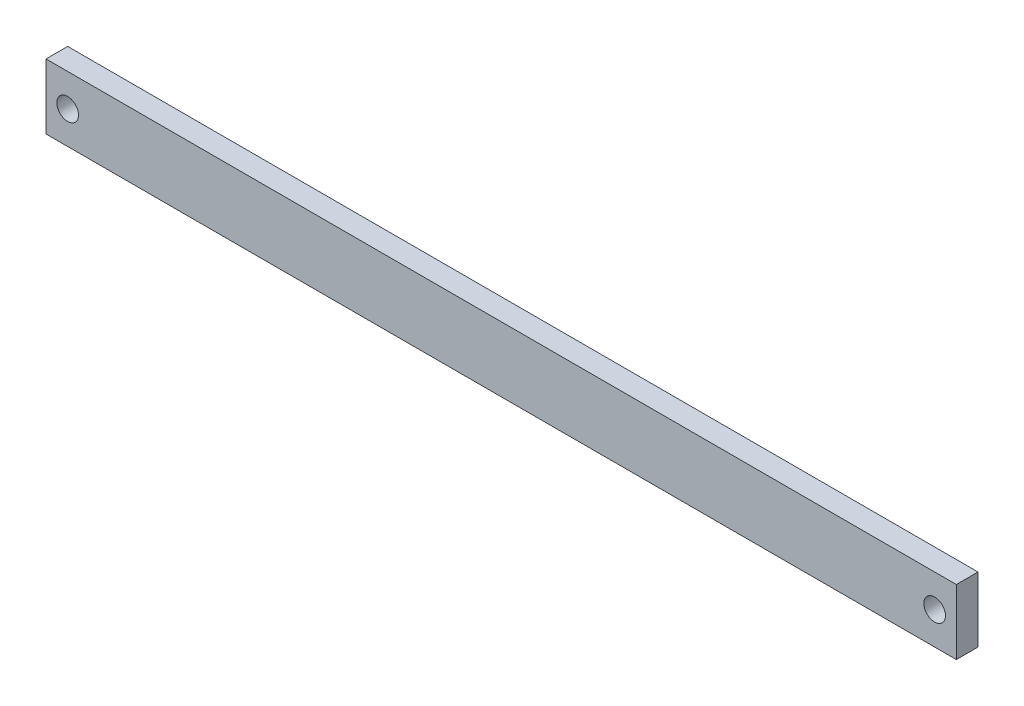
ISO-10303-21;
HEADER;
FILE_DESCRIPTION(('STEP AP214'),'2;1');
FILE_NAME('part.step','',(''),(''),'','','');
FILE_SCHEMA(('AUTOMOTIVE_DESIGN { 1 0 10303 214 1 1 1 1 }'));
ENDSEC;
DATA;
#1=APPLICATION_CONTEXT('core data for automotive mechanical design processes');
#2=APPLICATION_PROTOCOL_DEFINITION('international standard','automotive_design',2000,#1);
#3=PRODUCT_CONTEXT('',#1,'mechanical');
#4=PRODUCT('Part','Part','',(#3));
#5=PRODUCT_RELATED_PRODUCT_CATEGORY('part','',(#4));
#6=PRODUCT_DEFINITION_FORMATION('','',#4);
#7=PRODUCT_DEFINITION_CONTEXT('part definition',#1,'design');
#8=PRODUCT_DEFINITION('design','',#6,#7);
#9=PRODUCT_DEFINITION_SHAPE('','',#8);
#10=(LENGTH_UNIT() NAMED_UNIT(*) SI_UNIT(.MILLI.,.METRE.));
#11=(NAMED_UNIT(*) PLANE_ANGLE_UNIT() SI_UNIT($,.RADIAN.));
#12=(NAMED_UNIT(*) SI_UNIT($,.STERADIAN.) SOLID_ANGLE_UNIT());
#13=UNCERTAINTY_MEASURE_WITH_UNIT(LENGTH_MEASURE(1.E-05),#10,'distance_accuracy_value','');
#14=(GEOMETRIC_REPRESENTATION_CONTEXT(3) GLOBAL_UNCERTAINTY_ASSIGNED_CONTEXT((#13)) GLOBAL_UNIT_ASSIGNED_CONTEXT((#10,
#11,#12)) REPRESENTATION_CONTEXT('',''));
#15=CARTESIAN_POINT('',(0.,0.,0.));
#16=DIRECTION('',(0.,0.,1.));
#17=DIRECTION('',(1.,0.,0.));
#18=AXIS2_PLACEMENT_3D('',#15,#16,#17);
#19=CARTESIAN_POINT('',(0.,0.,5.));
#20=DIRECTION('',(0.,0.,-1.));
#21=DIRECTION('',(-1.,0.,0.));
#22=AXIS2_PLACEMENT_3D('',#19,#20,#21);
#23=PLANE('',#22);
#24=DIRECTION('',(0.,1.,0.));
#25=VECTOR('',#24,1.);
#26=CARTESIAN_POINT('',(105.,-7.5,5.));
#27=LINE('',#26,#25);
#28=CARTESIAN_POINT('',(105.,-7.5,5.));
#29=VERTEX_POINT('',#28);
#30=CARTESIAN_POINT('',(105.,7.5,5.));
#31=VERTEX_POINT('',#30);
#32=EDGE_CURVE('E91',#29,#31,#27,.T.);
#33=ORIENTED_EDGE('',*,*,#32,.T.);
#34=DIRECTION('',(-1.,0.,0.));
#35=VECTOR('',#34,1.);
#36=CARTESIAN_POINT('',(-105.,7.5,5.));
#37=LINE('',#36,#35);
#38=CARTESIAN_POINT('',(-105.,7.5,5.));
#39=VERTEX_POINT('',#38);
#40=EDGE_CURVE('E86',#31,#39,#37,.T.);
#41=ORIENTED_EDGE('',*,*,#40,.T.);
#42=DIRECTION('',(0.,-1.,0.));
#43=VECTOR('',#42,1.);
#44=CARTESIAN_POINT('',(-105.,-7.5,5.));
#45=LINE('',#44,#43);
#46=CARTESIAN_POINT('',(-105.,-7.5,5.));
#47=VERTEX_POINT('',#46);
#48=EDGE_CURVE('E89',#39,#47,#45,.T.);
#49=ORIENTED_EDGE('',*,*,#48,.T.);
#50=DIRECTION('',(1.,0.,0.));
#51=VECTOR('',#50,1.);
#52=CARTESIAN_POINT('',(-105.,-7.5,5.));
#53=LINE('',#52,#51);
#54=EDGE_CURVE('E56',#47,#29,#53,.T.);
#55=ORIENTED_EDGE('',*,*,#54,.T.);
#56=EDGE_LOOP('',(#33,#41,#49,#55));
#57=FACE_BOUND('',#56,.T.);
#58=CARTESIAN_POINT('',(100.,0.,5.));
#59=DIRECTION('',(0.,0.,1.));
#60=DIRECTION('',(1.,0.,0.));
#61=AXIS2_PLACEMENT_3D('',#58,#59,#60);
#62=CIRCLE('',#61,2.49999999999999);
#63=CARTESIAN_POINT('',(102.5,0.,5.));
#64=VERTEX_POINT('',#63);
#65=EDGE_CURVE('E106',#64,#64,#62,.T.);
#66=ORIENTED_EDGE('',*,*,#65,.F.);
#67=EDGE_LOOP('',(#66));
#68=FACE_BOUND('',#67,.T.);
#69=CARTESIAN_POINT('',(-100.,0.,5.));
#70=DIRECTION('',(0.,0.,1.));
#71=DIRECTION('',(1.,0.,0.));
#72=AXIS2_PLACEMENT_3D('',#69,#70,#71);
#73=CIRCLE('',#72,2.49999999999999);
#74=CARTESIAN_POINT('',(-97.5,0.,5.));
#75=VERTEX_POINT('',#74);
#76=EDGE_CURVE('E121',#75,#75,#73,.T.);
#77=ORIENTED_EDGE('',*,*,#76,.F.);
#78=EDGE_LOOP('',(#77));
#79=FACE_BOUND('',#78,.T.);
#80=ADVANCED_FACE('F39',(#57,#68,#79),#23,.F.);
#81=CARTESIAN_POINT('',(0.,0.,0.));
#82=DIRECTION('',(0.,0.,-1.));
#83=DIRECTION('',(-1.,0.,0.));
#84=AXIS2_PLACEMENT_3D('',#81,#82,#83);
#85=PLANE('',#84);
#86=CARTESIAN_POINT('',(100.,0.,0.));
#87=DIRECTION('',(0.,0.,1.));
#88=DIRECTION('',(1.,0.,0.));
#89=AXIS2_PLACEMENT_3D('',#86,#87,#88);
#90=CIRCLE('',#89,2.49999999999999);
#91=CARTESIAN_POINT('',(102.5,0.,0.));
#92=VERTEX_POINT('',#91);
#93=EDGE_CURVE('E118',#92,#92,#90,.T.);
#94=ORIENTED_EDGE('',*,*,#93,.T.);
#95=EDGE_LOOP('',(#94));
#96=FACE_BOUND('',#95,.T.);
#97=DIRECTION('',(0.,1.,0.));
#98=VECTOR('',#97,1.);
#99=CARTESIAN_POINT('',(105.,-7.5,0.));
#100=LINE('',#99,#98);
#101=CARTESIAN_POINT('',(105.,-7.5,0.));
#102=VERTEX_POINT('',#101);
#103=CARTESIAN_POINT('',(105.,7.5,0.));
#104=VERTEX_POINT('',#103);
#105=EDGE_CURVE('E103',#102,#104,#100,.T.);
#106=ORIENTED_EDGE('',*,*,#105,.F.);
#107=DIRECTION('',(1.,0.,0.));
#108=VECTOR('',#107,1.);
#109=CARTESIAN_POINT('',(-105.,-7.5,0.));
#110=LINE('',#109,#108);
#111=CARTESIAN_POINT('',(-105.,-7.5,0.));
#112=VERTEX_POINT('',#111);
#113=EDGE_CURVE('E79',#112,#102,#110,.T.);
#114=ORIENTED_EDGE('',*,*,#113,.F.);
#115=DIRECTION('',(0.,-1.,0.));
#116=VECTOR('',#115,1.);
#117=CARTESIAN_POINT('',(-105.,-7.5,0.));
#118=LINE('',#117,#116);
#119=CARTESIAN_POINT('',(-105.,7.5,0.));
#120=VERTEX_POINT('',#119);
#121=EDGE_CURVE('E73',#120,#112,#118,.T.);
#122=ORIENTED_EDGE('',*,*,#121,.F.);
#123=DIRECTION('',(-1.,0.,0.));
#124=VECTOR('',#123,1.);
#125=CARTESIAN_POINT('',(-105.,7.5,0.));
#126=LINE('',#125,#124);
#127=EDGE_CURVE('E95',#104,#120,#126,.T.);
#128=ORIENTED_EDGE('',*,*,#127,.F.);
#129=EDGE_LOOP('',(#106,#114,#122,#128));
#130=FACE_BOUND('',#129,.T.);
#131=CARTESIAN_POINT('',(-100.,0.,0.));
#132=DIRECTION('',(0.,0.,1.));
#133=DIRECTION('',(1.,0.,0.));
#134=AXIS2_PLACEMENT_3D('',#131,#132,#133);
#135=CIRCLE('',#134,2.49999999999999);
#136=CARTESIAN_POINT('',(-97.5,0.,0.));
#137=VERTEX_POINT('',#136);
#138=EDGE_CURVE('E124',#137,#137,#135,.T.);
#139=ORIENTED_EDGE('',*,*,#138,.T.);
#140=EDGE_LOOP('',(#139));
#141=FACE_BOUND('',#140,.T.);
#142=ADVANCED_FACE('F114',(#96,#130,#141),#85,.T.);
#143=CARTESIAN_POINT('',(105.,-7.5,5.));
#144=DIRECTION('',(-1.,0.,0.));
#145=DIRECTION('',(0.,0.,1.));
#146=AXIS2_PLACEMENT_3D('',#143,#144,#145);
#147=PLANE('',#146);
#148=ORIENTED_EDGE('',*,*,#105,.T.);
#149=DIRECTION('',(0.,0.,-1.));
#150=VECTOR('',#149,1.);
#151=CARTESIAN_POINT('',(105.,7.5,5.));
#152=LINE('',#151,#150);
#153=EDGE_CURVE('E11',#31,#104,#152,.T.);
#154=ORIENTED_EDGE('',*,*,#153,.F.);
#155=ORIENTED_EDGE('',*,*,#32,.F.);
#156=DIRECTION('',(0.,0.,-1.));
#157=VECTOR('',#156,1.);
#158=CARTESIAN_POINT('',(105.,-7.5,5.));
#159=LINE('',#158,#157);
#160=EDGE_CURVE('E99',#29,#102,#159,.T.);
#161=ORIENTED_EDGE('',*,*,#160,.T.);
#162=EDGE_LOOP('',(#148,#154,#155,#161));
#163=FACE_BOUND('',#162,.T.);
#164=ADVANCED_FACE('F41',(#163),#147,.F.);
#165=CARTESIAN_POINT('',(-105.,7.5,5.));
#166=DIRECTION('',(0.,-1.,0.));
#167=DIRECTION('',(0.,0.,-1.));
#168=AXIS2_PLACEMENT_3D('',#165,#166,#167);
#169=PLANE('',#168);
#170=ORIENTED_EDGE('',*,*,#127,.T.);
#171=DIRECTION('',(0.,0.,-1.));
#172=VECTOR('',#171,1.);
#173=CARTESIAN_POINT('',(-105.,7.5,5.));
#174=LINE('',#173,#172);
#175=EDGE_CURVE('E48',#39,#120,#174,.T.);
#176=ORIENTED_EDGE('',*,*,#175,.F.);
#177=ORIENTED_EDGE('',*,*,#40,.F.);
#178=ORIENTED_EDGE('',*,*,#153,.T.);
#179=EDGE_LOOP('',(#170,#176,#177,#178));
#180=FACE_BOUND('',#179,.T.);
#181=ADVANCED_FACE('F94',(#180),#169,.F.);
#182=CARTESIAN_POINT('',(-105.,-7.5,5.));
#183=DIRECTION('',(1.,0.,0.));
#184=DIRECTION('',(0.,0.,-1.));
#185=AXIS2_PLACEMENT_3D('',#182,#183,#184);
#186=PLANE('',#185);
#187=ORIENTED_EDGE('',*,*,#121,.T.);
#188=DIRECTION('',(0.,0.,-1.));
#189=VECTOR('',#188,1.);
#190=CARTESIAN_POINT('',(-105.,-7.5,5.));
#191=LINE('',#190,#189);
#192=EDGE_CURVE('E96',#47,#112,#191,.T.);
#193=ORIENTED_EDGE('',*,*,#192,.F.);
#194=ORIENTED_EDGE('',*,*,#48,.F.);
#195=ORIENTED_EDGE('',*,*,#175,.T.);
#196=EDGE_LOOP('',(#187,#193,#194,#195));
#197=FACE_BOUND('',#196,.T.);
#198=ADVANCED_FACE('F97',(#197),#186,.F.);
#199=CARTESIAN_POINT('',(-105.,-7.5,5.));
#200=DIRECTION('',(0.,1.,0.));
#201=DIRECTION('',(0.,0.,1.));
#202=AXIS2_PLACEMENT_3D('',#199,#200,#201);
#203=PLANE('',#202);
#204=ORIENTED_EDGE('',*,*,#113,.T.);
#205=ORIENTED_EDGE('',*,*,#160,.F.);
#206=ORIENTED_EDGE('',*,*,#54,.F.);
#207=ORIENTED_EDGE('',*,*,#192,.T.);
#208=EDGE_LOOP('',(#204,#205,#206,#207));
#209=FACE_BOUND('',#208,.T.);
#210=ADVANCED_FACE('F111',(#209),#203,.F.);
#211=CARTESIAN_POINT('',(100.,0.,5.));
#212=DIRECTION('',(0.,0.,-1.));
#213=DIRECTION('',(-1.,0.,0.));
#214=AXIS2_PLACEMENT_3D('',#211,#212,#213);
#215=CYLINDRICAL_SURFACE('',#214,2.49999999999999);
#216=ORIENTED_EDGE('',*,*,#65,.T.);
#217=EDGE_LOOP('',(#216));
#218=FACE_BOUND('',#217,.T.);
#219=ORIENTED_EDGE('',*,*,#93,.F.);
#220=EDGE_LOOP('',(#219));
#221=FACE_BOUND('',#220,.T.);
#222=ADVANCED_FACE('F141',(#218,#221),#215,.F.);
#223=CARTESIAN_POINT('',(-100.,0.,5.));
#224=DIRECTION('',(0.,0.,-1.));
#225=DIRECTION('',(-1.,0.,0.));
#226=AXIS2_PLACEMENT_3D('',#223,#224,#225);
#227=CYLINDRICAL_SURFACE('',#226,2.49999999999999);
#228=ORIENTED_EDGE('',*,*,#76,.T.);
#229=EDGE_LOOP('',(#228));
#230=FACE_BOUND('',#229,.T.);
#231=ORIENTED_EDGE('',*,*,#138,.F.);
#232=EDGE_LOOP('',(#231));
#233=FACE_BOUND('',#232,.T.);
#234=ADVANCED_FACE('F130',(#230,#233),#227,.F.);
#235=CLOSED_SHELL('',(#80,#142,#164,#181,#198,#210,#222,#234));
#236=MANIFOLD_SOLID_BREP('B2',#235);
#237=ADVANCED_BREP_SHAPE_REPRESENTATION('',(#18,#236),#14);
#238=SHAPE_DEFINITION_REPRESENTATION(#9,#237);
ENDSEC;
END-ISO-10303-21;
